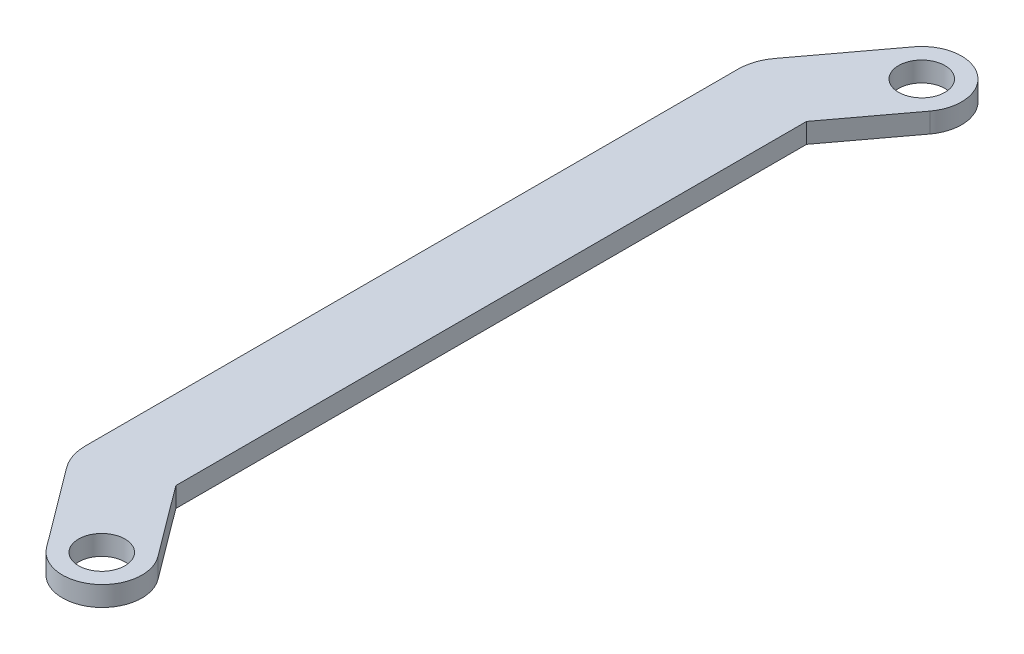
ISO-10303-21;
HEADER;
FILE_DESCRIPTION(('STEP AP214'),'2;1');
FILE_NAME('part.step','',(''),(''),'','','');
FILE_SCHEMA(('AUTOMOTIVE_DESIGN { 1 0 10303 214 1 1 1 1 }'));
ENDSEC;
DATA;
#1=APPLICATION_CONTEXT('core data for automotive mechanical design processes');
#2=APPLICATION_PROTOCOL_DEFINITION('international standard','automotive_design',2000,#1);
#3=PRODUCT_CONTEXT('',#1,'mechanical');
#4=PRODUCT('Part','Part','',(#3));
#5=PRODUCT_RELATED_PRODUCT_CATEGORY('part','',(#4));
#6=PRODUCT_DEFINITION_FORMATION('','',#4);
#7=PRODUCT_DEFINITION_CONTEXT('part definition',#1,'design');
#8=PRODUCT_DEFINITION('design','',#6,#7);
#9=PRODUCT_DEFINITION_SHAPE('','',#8);
#10=(LENGTH_UNIT() NAMED_UNIT(*) SI_UNIT(.MILLI.,.METRE.));
#11=(NAMED_UNIT(*) PLANE_ANGLE_UNIT() SI_UNIT($,.RADIAN.));
#12=(NAMED_UNIT(*) SI_UNIT($,.STERADIAN.) SOLID_ANGLE_UNIT());
#13=UNCERTAINTY_MEASURE_WITH_UNIT(LENGTH_MEASURE(1.E-05),#10,'distance_accuracy_value','');
#14=(GEOMETRIC_REPRESENTATION_CONTEXT(3) GLOBAL_UNCERTAINTY_ASSIGNED_CONTEXT((#13)) GLOBAL_UNIT_ASSIGNED_CONTEXT((#10,
#11,#12)) REPRESENTATION_CONTEXT('',''));
#15=CARTESIAN_POINT('',(0.,0.,0.));
#16=DIRECTION('',(0.,0.,1.));
#17=DIRECTION('',(1.,0.,0.));
#18=AXIS2_PLACEMENT_3D('',#15,#16,#17);
#19=CARTESIAN_POINT('',(0.,3.,-61.81));
#20=DIRECTION('',(0.,1.,0.));
#21=DIRECTION('',(0.,0.,1.));
#22=AXIS2_PLACEMENT_3D('',#19,#20,#21);
#23=PLANE('',#22);
#24=CARTESIAN_POINT('',(0.,3.,-61.81));
#25=DIRECTION('',(0.,1.,0.));
#26=DIRECTION('',(0.,0.,1.));
#27=AXIS2_PLACEMENT_3D('',#24,#25,#26);
#28=CIRCLE('',#27,3.5);
#29=CARTESIAN_POINT('',(0.,3.,-58.31));
#30=VERTEX_POINT('',#29);
#31=EDGE_CURVE('E146',#30,#30,#28,.T.);
#32=ORIENTED_EDGE('',*,*,#31,.F.);
#33=EDGE_LOOP('',(#32));
#34=FACE_BOUND('',#33,.T.);
#35=CARTESIAN_POINT('',(0.,3.,-61.81));
#36=DIRECTION('',(0.,1.,0.));
#37=DIRECTION('',(0.,0.,1.));
#38=AXIS2_PLACEMENT_3D('',#35,#36,#37);
#39=CIRCLE('',#38,6.);
#40=CARTESIAN_POINT('',(4.8086504373007,3.,-58.2215628789335));
#41=VERTEX_POINT('',#40);
#42=CARTESIAN_POINT('',(-4.80865043730069,3.,-65.3984371210665));
#43=VERTEX_POINT('',#42);
#44=EDGE_CURVE('E162',#41,#43,#39,.T.);
#45=ORIENTED_EDGE('',*,*,#44,.T.);
#46=DIRECTION('',(-0.598072853511079,0.,0.801441739550116));
#47=VECTOR('',#46,1.);
#48=CARTESIAN_POINT('',(-4.80865043730069,3.,-65.3984371210665));
#49=LINE('',#48,#47);
#50=CARTESIAN_POINT('',(-13.7504735281473,3.,-53.4160336218835));
#51=VERTEX_POINT('',#50);
#52=EDGE_CURVE('E98',#43,#51,#49,.T.);
#53=ORIENTED_EDGE('',*,*,#52,.T.);
#54=CARTESIAN_POINT('',(-8.1403813512965,3.,-49.2295236473059));
#55=DIRECTION('',(0.,1.,0.));
#56=DIRECTION('',(0.,0.,-1.));
#57=AXIS2_PLACEMENT_3D('',#54,#55,#56);
#58=CIRCLE('',#57,7.);
#59=CARTESIAN_POINT('',(-15.1403813512965,3.,-49.2295236473059));
#60=VERTEX_POINT('',#59);
#61=EDGE_CURVE('E183',#51,#60,#58,.T.);
#62=ORIENTED_EDGE('',*,*,#61,.T.);
#63=DIRECTION('',(0.,0.,1.));
#64=VECTOR('',#63,1.);
#65=CARTESIAN_POINT('',(-15.1403813512965,3.,-49.2295236473059));
#66=LINE('',#65,#64);
#67=CARTESIAN_POINT('',(-15.1403813512965,3.,49.2295236473059));
#68=VERTEX_POINT('',#67);
#69=EDGE_CURVE('E201',#60,#68,#66,.T.);
#70=ORIENTED_EDGE('',*,*,#69,.T.);
#71=CARTESIAN_POINT('',(-8.1403813512965,3.,49.2295236473059));
#72=DIRECTION('',(0.,1.,0.));
#73=DIRECTION('',(0.,0.,1.));
#74=AXIS2_PLACEMENT_3D('',#71,#72,#73);
#75=CIRCLE('',#74,7.);
#76=CARTESIAN_POINT('',(-13.7504735281473,3.,53.4160336218835));
#77=VERTEX_POINT('',#76);
#78=EDGE_CURVE('E198',#68,#77,#75,.T.);
#79=ORIENTED_EDGE('',*,*,#78,.T.);
#80=DIRECTION('',(0.598072853511079,0.,0.801441739550116));
#81=VECTOR('',#80,1.);
#82=CARTESIAN_POINT('',(-4.80865043730069,3.,65.3984371210665));
#83=LINE('',#82,#81);
#84=CARTESIAN_POINT('',(-4.80865043730069,3.,65.3984371210665));
#85=VERTEX_POINT('',#84);
#86=EDGE_CURVE('E200',#77,#85,#83,.T.);
#87=ORIENTED_EDGE('',*,*,#86,.T.);
#88=CARTESIAN_POINT('',(0.,3.,61.81));
#89=DIRECTION('',(0.,1.,0.));
#90=DIRECTION('',(0.,0.,-1.));
#91=AXIS2_PLACEMENT_3D('',#88,#89,#90);
#92=CIRCLE('',#91,6.);
#93=CARTESIAN_POINT('',(4.80865043730071,3.,58.2215628789335));
#94=VERTEX_POINT('',#93);
#95=EDGE_CURVE('E123',#85,#94,#92,.T.);
#96=ORIENTED_EDGE('',*,*,#95,.T.);
#97=DIRECTION('',(-0.598072853511079,0.,-0.801441739550116));
#98=VECTOR('',#97,1.);
#99=CARTESIAN_POINT('',(4.8086504373007,3.,58.2215628789335));
#100=LINE('',#99,#98);
#101=CARTESIAN_POINT('',(-3.1403813512965,3.,47.5695397566794));
#102=VERTEX_POINT('',#101);
#103=EDGE_CURVE('E117',#94,#102,#100,.T.);
#104=ORIENTED_EDGE('',*,*,#103,.T.);
#105=DIRECTION('',(0.,0.,-1.));
#106=VECTOR('',#105,1.);
#107=CARTESIAN_POINT('',(-3.1403813512965,3.,47.5695397566794));
#108=LINE('',#107,#106);
#109=CARTESIAN_POINT('',(-3.1403813512965,3.,-47.5695397566794));
#110=VERTEX_POINT('',#109);
#111=EDGE_CURVE('E121',#102,#110,#108,.T.);
#112=ORIENTED_EDGE('',*,*,#111,.T.);
#113=DIRECTION('',(0.598072853511079,0.,-0.801441739550116));
#114=VECTOR('',#113,1.);
#115=CARTESIAN_POINT('',(4.8086504373007,3.,-58.2215628789335));
#116=LINE('',#115,#114);
#117=EDGE_CURVE('E50',#110,#41,#116,.T.);
#118=ORIENTED_EDGE('',*,*,#117,.T.);
#119=EDGE_LOOP('',(#45,#53,#62,#70,#79,#87,#96,#104,#112,#118));
#120=FACE_BOUND('',#119,.T.);
#121=CARTESIAN_POINT('',(0.,3.,61.881));
#122=DIRECTION('',(0.,1.,0.));
#123=DIRECTION('',(0.,0.,1.));
#124=AXIS2_PLACEMENT_3D('',#121,#122,#123);
#125=CIRCLE('',#124,3.5);
#126=CARTESIAN_POINT('',(0.,3.,65.381));
#127=VERTEX_POINT('',#126);
#128=EDGE_CURVE('E212',#127,#127,#125,.T.);
#129=ORIENTED_EDGE('',*,*,#128,.F.);
#130=EDGE_LOOP('',(#129));
#131=FACE_BOUND('',#130,.T.);
#132=ADVANCED_FACE('F33',(#34,#120,#131),#23,.T.);
#133=CARTESIAN_POINT('',(0.,0.,-61.81));
#134=DIRECTION('',(0.,1.,0.));
#135=DIRECTION('',(0.,0.,1.));
#136=AXIS2_PLACEMENT_3D('',#133,#134,#135);
#137=PLANE('',#136);
#138=CARTESIAN_POINT('',(0.,0.,-61.81));
#139=DIRECTION('',(0.,1.,0.));
#140=DIRECTION('',(0.,0.,1.));
#141=AXIS2_PLACEMENT_3D('',#138,#139,#140);
#142=CIRCLE('',#141,6.);
#143=CARTESIAN_POINT('',(4.8086504373007,0.,-58.2215628789335));
#144=VERTEX_POINT('',#143);
#145=CARTESIAN_POINT('',(-4.80865043730069,0.,-65.3984371210665));
#146=VERTEX_POINT('',#145);
#147=EDGE_CURVE('E142',#144,#146,#142,.T.);
#148=ORIENTED_EDGE('',*,*,#147,.F.);
#149=DIRECTION('',(0.598072853511079,0.,-0.801441739550116));
#150=VECTOR('',#149,1.);
#151=CARTESIAN_POINT('',(4.8086504373007,0.,-58.2215628789335));
#152=LINE('',#151,#150);
#153=CARTESIAN_POINT('',(-3.1403813512965,0.,-47.5695397566794));
#154=VERTEX_POINT('',#153);
#155=EDGE_CURVE('E90',#154,#144,#152,.T.);
#156=ORIENTED_EDGE('',*,*,#155,.F.);
#157=DIRECTION('',(0.,0.,-1.));
#158=VECTOR('',#157,1.);
#159=CARTESIAN_POINT('',(-3.1403813512965,0.,-47.5695397566794));
#160=LINE('',#159,#158);
#161=CARTESIAN_POINT('',(-3.1403813512965,0.,47.5695397566794));
#162=VERTEX_POINT('',#161);
#163=EDGE_CURVE('E84',#162,#154,#160,.T.);
#164=ORIENTED_EDGE('',*,*,#163,.F.);
#165=DIRECTION('',(-0.598072853511079,0.,-0.801441739550116));
#166=VECTOR('',#165,1.);
#167=CARTESIAN_POINT('',(4.8086504373007,0.,58.2215628789335));
#168=LINE('',#167,#166);
#169=CARTESIAN_POINT('',(4.80865043730071,0.,58.2215628789335));
#170=VERTEX_POINT('',#169);
#171=EDGE_CURVE('E132',#170,#162,#168,.T.);
#172=ORIENTED_EDGE('',*,*,#171,.F.);
#173=CARTESIAN_POINT('',(0.,0.,61.81));
#174=DIRECTION('',(0.,1.,0.));
#175=DIRECTION('',(0.,0.,-1.));
#176=AXIS2_PLACEMENT_3D('',#173,#174,#175);
#177=CIRCLE('',#176,6.);
#178=CARTESIAN_POINT('',(-4.80865043730069,0.,65.3984371210665));
#179=VERTEX_POINT('',#178);
#180=EDGE_CURVE('E157',#179,#170,#177,.T.);
#181=ORIENTED_EDGE('',*,*,#180,.F.);
#182=DIRECTION('',(0.598072853511079,0.,0.801441739550116));
#183=VECTOR('',#182,1.);
#184=CARTESIAN_POINT('',(-4.80865043730069,0.,65.3984371210665));
#185=LINE('',#184,#183);
#186=CARTESIAN_POINT('',(-13.7504735281473,0.,53.4160336218835));
#187=VERTEX_POINT('',#186);
#188=EDGE_CURVE('E155',#187,#179,#185,.T.);
#189=ORIENTED_EDGE('',*,*,#188,.F.);
#190=CARTESIAN_POINT('',(-8.1403813512965,0.,49.2295236473059));
#191=DIRECTION('',(0.,1.,0.));
#192=DIRECTION('',(0.,0.,1.));
#193=AXIS2_PLACEMENT_3D('',#190,#191,#192);
#194=CIRCLE('',#193,7.);
#195=CARTESIAN_POINT('',(-15.1403813512965,0.,49.2295236473059));
#196=VERTEX_POINT('',#195);
#197=EDGE_CURVE('E153',#196,#187,#194,.T.);
#198=ORIENTED_EDGE('',*,*,#197,.F.);
#199=DIRECTION('',(0.,0.,1.));
#200=VECTOR('',#199,1.);
#201=CARTESIAN_POINT('',(-15.1403813512965,0.,49.2295236473059));
#202=LINE('',#201,#200);
#203=CARTESIAN_POINT('',(-15.1403813512965,0.,-49.2295236473059));
#204=VERTEX_POINT('',#203);
#205=EDGE_CURVE('E151',#204,#196,#202,.T.);
#206=ORIENTED_EDGE('',*,*,#205,.F.);
#207=CARTESIAN_POINT('',(-8.1403813512965,0.,-49.2295236473059));
#208=DIRECTION('',(0.,1.,0.));
#209=DIRECTION('',(0.,0.,-1.));
#210=AXIS2_PLACEMENT_3D('',#207,#208,#209);
#211=CIRCLE('',#210,7.);
#212=CARTESIAN_POINT('',(-13.7504735281473,0.,-53.4160336218835));
#213=VERTEX_POINT('',#212);
#214=EDGE_CURVE('E148',#213,#204,#211,.T.);
#215=ORIENTED_EDGE('',*,*,#214,.F.);
#216=DIRECTION('',(-0.598072853511079,0.,0.801441739550116));
#217=VECTOR('',#216,1.);
#218=CARTESIAN_POINT('',(-4.80865043730069,0.,-65.3984371210665));
#219=LINE('',#218,#217);
#220=EDGE_CURVE('E145',#146,#213,#219,.T.);
#221=ORIENTED_EDGE('',*,*,#220,.F.);
#222=EDGE_LOOP('',(#148,#156,#164,#172,#181,#189,#198,#206,#215,#221));
#223=FACE_BOUND('',#222,.T.);
#224=CARTESIAN_POINT('',(0.,0.,-61.81));
#225=DIRECTION('',(0.,1.,0.));
#226=DIRECTION('',(0.,0.,1.));
#227=AXIS2_PLACEMENT_3D('',#224,#225,#226);
#228=CIRCLE('',#227,3.5);
#229=CARTESIAN_POINT('',(0.,0.,-58.31));
#230=VERTEX_POINT('',#229);
#231=EDGE_CURVE('E209',#230,#230,#228,.T.);
#232=ORIENTED_EDGE('',*,*,#231,.T.);
#233=EDGE_LOOP('',(#232));
#234=FACE_BOUND('',#233,.T.);
#235=CARTESIAN_POINT('',(0.,0.,61.881));
#236=DIRECTION('',(0.,1.,0.));
#237=DIRECTION('',(0.,0.,1.));
#238=AXIS2_PLACEMENT_3D('',#235,#236,#237);
#239=CIRCLE('',#238,3.5);
#240=CARTESIAN_POINT('',(0.,0.,65.381));
#241=VERTEX_POINT('',#240);
#242=EDGE_CURVE('E215',#241,#241,#239,.T.);
#243=ORIENTED_EDGE('',*,*,#242,.T.);
#244=EDGE_LOOP('',(#243));
#245=FACE_BOUND('',#244,.T.);
#246=ADVANCED_FACE('F186',(#223,#234,#245),#137,.F.);
#247=CARTESIAN_POINT('',(0.,3.,-61.81));
#248=DIRECTION('',(0.,-1.,0.));
#249=DIRECTION('',(0.,0.,-1.));
#250=AXIS2_PLACEMENT_3D('',#247,#248,#249);
#251=CYLINDRICAL_SURFACE('',#250,6.);
#252=ORIENTED_EDGE('',*,*,#147,.T.);
#253=DIRECTION('',(0.,-1.,0.));
#254=VECTOR('',#253,1.);
#255=CARTESIAN_POINT('',(-4.80865043730069,3.,-65.3984371210665));
#256=LINE('',#255,#254);
#257=EDGE_CURVE('E11',#43,#146,#256,.T.);
#258=ORIENTED_EDGE('',*,*,#257,.F.);
#259=ORIENTED_EDGE('',*,*,#44,.F.);
#260=DIRECTION('',(0.,-1.,0.));
#261=VECTOR('',#260,1.);
#262=CARTESIAN_POINT('',(4.8086504373007,3.,-58.2215628789335));
#263=LINE('',#262,#261);
#264=EDGE_CURVE('E138',#41,#144,#263,.T.);
#265=ORIENTED_EDGE('',*,*,#264,.T.);
#266=EDGE_LOOP('',(#252,#258,#259,#265));
#267=FACE_BOUND('',#266,.T.);
#268=ADVANCED_FACE('F35',(#267),#251,.T.);
#269=CARTESIAN_POINT('',(-4.80865043730069,3.,-65.3984371210665));
#270=DIRECTION('',(0.801441739550116,0.,0.598072853511078));
#271=DIRECTION('',(0.598072853511079,0.,-0.801441739550116));
#272=AXIS2_PLACEMENT_3D('',#269,#270,#271);
#273=PLANE('',#272);
#274=ORIENTED_EDGE('',*,*,#220,.T.);
#275=DIRECTION('',(0.,-1.,0.));
#276=VECTOR('',#275,1.);
#277=CARTESIAN_POINT('',(-13.7504735281473,3.,-53.4160336218835));
#278=LINE('',#277,#276);
#279=EDGE_CURVE('E42',#51,#213,#278,.T.);
#280=ORIENTED_EDGE('',*,*,#279,.F.);
#281=ORIENTED_EDGE('',*,*,#52,.F.);
#282=ORIENTED_EDGE('',*,*,#257,.T.);
#283=EDGE_LOOP('',(#274,#280,#281,#282));
#284=FACE_BOUND('',#283,.T.);
#285=ADVANCED_FACE('F255',(#284),#273,.F.);
#286=CARTESIAN_POINT('',(-8.1403813512965,3.,-49.2295236473059));
#287=DIRECTION('',(0.,-1.,0.));
#288=DIRECTION('',(0.,0.,-1.));
#289=AXIS2_PLACEMENT_3D('',#286,#287,#288);
#290=CYLINDRICAL_SURFACE('',#289,7.);
#291=ORIENTED_EDGE('',*,*,#214,.T.);
#292=DIRECTION('',(0.,-1.,0.));
#293=VECTOR('',#292,1.);
#294=CARTESIAN_POINT('',(-15.1403813512965,3.,-49.2295236473059));
#295=LINE('',#294,#293);
#296=EDGE_CURVE('E175',#60,#204,#295,.T.);
#297=ORIENTED_EDGE('',*,*,#296,.F.);
#298=ORIENTED_EDGE('',*,*,#61,.F.);
#299=ORIENTED_EDGE('',*,*,#279,.T.);
#300=EDGE_LOOP('',(#291,#297,#298,#299));
#301=FACE_BOUND('',#300,.T.);
#302=ADVANCED_FACE('F181',(#301),#290,.T.);
#303=CARTESIAN_POINT('',(-15.1403813512965,3.,49.2295236473059));
#304=DIRECTION('',(1.,0.,0.));
#305=DIRECTION('',(0.,0.,-1.));
#306=AXIS2_PLACEMENT_3D('',#303,#304,#305);
#307=PLANE('',#306);
#308=ORIENTED_EDGE('',*,*,#205,.T.);
#309=DIRECTION('',(0.,-1.,0.));
#310=VECTOR('',#309,1.);
#311=CARTESIAN_POINT('',(-15.1403813512965,3.,49.2295236473059));
#312=LINE('',#311,#310);
#313=EDGE_CURVE('E172',#68,#196,#312,.T.);
#314=ORIENTED_EDGE('',*,*,#313,.F.);
#315=ORIENTED_EDGE('',*,*,#69,.F.);
#316=ORIENTED_EDGE('',*,*,#296,.T.);
#317=EDGE_LOOP('',(#308,#314,#315,#316));
#318=FACE_BOUND('',#317,.T.);
#319=ADVANCED_FACE('F192',(#318),#307,.F.);
#320=CARTESIAN_POINT('',(-8.1403813512965,3.,49.2295236473059));
#321=DIRECTION('',(0.,-1.,0.));
#322=DIRECTION('',(0.,0.,-1.));
#323=AXIS2_PLACEMENT_3D('',#320,#321,#322);
#324=CYLINDRICAL_SURFACE('',#323,7.);
#325=ORIENTED_EDGE('',*,*,#197,.T.);
#326=DIRECTION('',(0.,-1.,0.));
#327=VECTOR('',#326,1.);
#328=CARTESIAN_POINT('',(-13.7504735281473,3.,53.4160336218835));
#329=LINE('',#328,#327);
#330=EDGE_CURVE('E169',#77,#187,#329,.T.);
#331=ORIENTED_EDGE('',*,*,#330,.F.);
#332=ORIENTED_EDGE('',*,*,#78,.F.);
#333=ORIENTED_EDGE('',*,*,#313,.T.);
#334=EDGE_LOOP('',(#325,#331,#332,#333));
#335=FACE_BOUND('',#334,.T.);
#336=ADVANCED_FACE('F196',(#335),#324,.T.);
#337=CARTESIAN_POINT('',(-4.80865043730069,3.,65.3984371210665));
#338=DIRECTION('',(0.801441739550116,0.,-0.598072853511078));
#339=DIRECTION('',(-0.598072853511079,0.,-0.801441739550116));
#340=AXIS2_PLACEMENT_3D('',#337,#338,#339);
#341=PLANE('',#340);
#342=ORIENTED_EDGE('',*,*,#188,.T.);
#343=DIRECTION('',(0.,-1.,0.));
#344=VECTOR('',#343,1.);
#345=CARTESIAN_POINT('',(-4.80865043730069,3.,65.3984371210665));
#346=LINE('',#345,#344);
#347=EDGE_CURVE('E166',#85,#179,#346,.T.);
#348=ORIENTED_EDGE('',*,*,#347,.F.);
#349=ORIENTED_EDGE('',*,*,#86,.F.);
#350=ORIENTED_EDGE('',*,*,#330,.T.);
#351=EDGE_LOOP('',(#342,#348,#349,#350));
#352=FACE_BOUND('',#351,.T.);
#353=ADVANCED_FACE('F245',(#352),#341,.F.);
#354=CARTESIAN_POINT('',(0.,3.,61.81));
#355=DIRECTION('',(0.,-1.,0.));
#356=DIRECTION('',(0.,0.,-1.));
#357=AXIS2_PLACEMENT_3D('',#354,#355,#356);
#358=CYLINDRICAL_SURFACE('',#357,6.);
#359=ORIENTED_EDGE('',*,*,#180,.T.);
#360=DIRECTION('',(0.,-1.,0.));
#361=VECTOR('',#360,1.);
#362=CARTESIAN_POINT('',(4.80865043730071,3.,58.2215628789335));
#363=LINE('',#362,#361);
#364=EDGE_CURVE('E133',#94,#170,#363,.T.);
#365=ORIENTED_EDGE('',*,*,#364,.F.);
#366=ORIENTED_EDGE('',*,*,#95,.F.);
#367=ORIENTED_EDGE('',*,*,#347,.T.);
#368=EDGE_LOOP('',(#359,#365,#366,#367));
#369=FACE_BOUND('',#368,.T.);
#370=ADVANCED_FACE('F242',(#369),#358,.T.);
#371=CARTESIAN_POINT('',(4.8086504373007,3.,58.2215628789335));
#372=DIRECTION('',(-0.801441739550116,0.,0.598072853511079));
#373=DIRECTION('',(0.598072853511079,0.,0.801441739550116));
#374=AXIS2_PLACEMENT_3D('',#371,#372,#373);
#375=PLANE('',#374);
#376=ORIENTED_EDGE('',*,*,#171,.T.);
#377=DIRECTION('',(0.,-1.,0.));
#378=VECTOR('',#377,1.);
#379=CARTESIAN_POINT('',(-3.1403813512965,3.,47.5695397566794));
#380=LINE('',#379,#378);
#381=EDGE_CURVE('E129',#102,#162,#380,.T.);
#382=ORIENTED_EDGE('',*,*,#381,.F.);
#383=ORIENTED_EDGE('',*,*,#103,.F.);
#384=ORIENTED_EDGE('',*,*,#364,.T.);
#385=EDGE_LOOP('',(#376,#382,#383,#384));
#386=FACE_BOUND('',#385,.T.);
#387=ADVANCED_FACE('F130',(#386),#375,.F.);
#388=CARTESIAN_POINT('',(-3.1403813512965,3.,-47.5695397566794));
#389=DIRECTION('',(-1.,0.,0.));
#390=DIRECTION('',(0.,0.,1.));
#391=AXIS2_PLACEMENT_3D('',#388,#389,#390);
#392=PLANE('',#391);
#393=ORIENTED_EDGE('',*,*,#163,.T.);
#394=DIRECTION('',(0.,-1.,0.));
#395=VECTOR('',#394,1.);
#396=CARTESIAN_POINT('',(-3.1403813512965,3.,-47.5695397566794));
#397=LINE('',#396,#395);
#398=EDGE_CURVE('E134',#110,#154,#397,.T.);
#399=ORIENTED_EDGE('',*,*,#398,.F.);
#400=ORIENTED_EDGE('',*,*,#111,.F.);
#401=ORIENTED_EDGE('',*,*,#381,.T.);
#402=EDGE_LOOP('',(#393,#399,#400,#401));
#403=FACE_BOUND('',#402,.T.);
#404=ADVANCED_FACE('F136',(#403),#392,.F.);
#405=CARTESIAN_POINT('',(4.8086504373007,3.,-58.2215628789335));
#406=DIRECTION('',(-0.801441739550116,0.,-0.598072853511079));
#407=DIRECTION('',(-0.598072853511079,0.,0.801441739550116));
#408=AXIS2_PLACEMENT_3D('',#405,#406,#407);
#409=PLANE('',#408);
#410=ORIENTED_EDGE('',*,*,#155,.T.);
#411=ORIENTED_EDGE('',*,*,#264,.F.);
#412=ORIENTED_EDGE('',*,*,#117,.F.);
#413=ORIENTED_EDGE('',*,*,#398,.T.);
#414=EDGE_LOOP('',(#410,#411,#412,#413));
#415=FACE_BOUND('',#414,.T.);
#416=ADVANCED_FACE('F235',(#415),#409,.F.);
#417=CARTESIAN_POINT('',(0.,3.,-61.81));
#418=DIRECTION('',(0.,-1.,0.));
#419=DIRECTION('',(0.,0.,-1.));
#420=AXIS2_PLACEMENT_3D('',#417,#418,#419);
#421=CYLINDRICAL_SURFACE('',#420,3.5);
#422=ORIENTED_EDGE('',*,*,#31,.T.);
#423=EDGE_LOOP('',(#422));
#424=FACE_BOUND('',#423,.T.);
#425=ORIENTED_EDGE('',*,*,#231,.F.);
#426=EDGE_LOOP('',(#425));
#427=FACE_BOUND('',#426,.T.);
#428=ADVANCED_FACE('F232',(#424,#427),#421,.F.);
#429=CARTESIAN_POINT('',(0.,3.,61.881));
#430=DIRECTION('',(0.,-1.,0.));
#431=DIRECTION('',(0.,0.,-1.));
#432=AXIS2_PLACEMENT_3D('',#429,#430,#431);
#433=CYLINDRICAL_SURFACE('',#432,3.5);
#434=ORIENTED_EDGE('',*,*,#128,.T.);
#435=EDGE_LOOP('',(#434));
#436=FACE_BOUND('',#435,.T.);
#437=ORIENTED_EDGE('',*,*,#242,.F.);
#438=EDGE_LOOP('',(#437));
#439=FACE_BOUND('',#438,.T.);
#440=ADVANCED_FACE('F221',(#436,#439),#433,.F.);
#441=CLOSED_SHELL('',(#132,#246,#268,#285,#302,#319,#336,#353,#370,#387,#404,#416,#428,#440));
#442=MANIFOLD_SOLID_BREP('B2',#441);
#443=ADVANCED_BREP_SHAPE_REPRESENTATION('',(#18,#442),#14);
#444=SHAPE_DEFINITION_REPRESENTATION(#9,#443);
ENDSEC;
END-ISO-10303-21;
